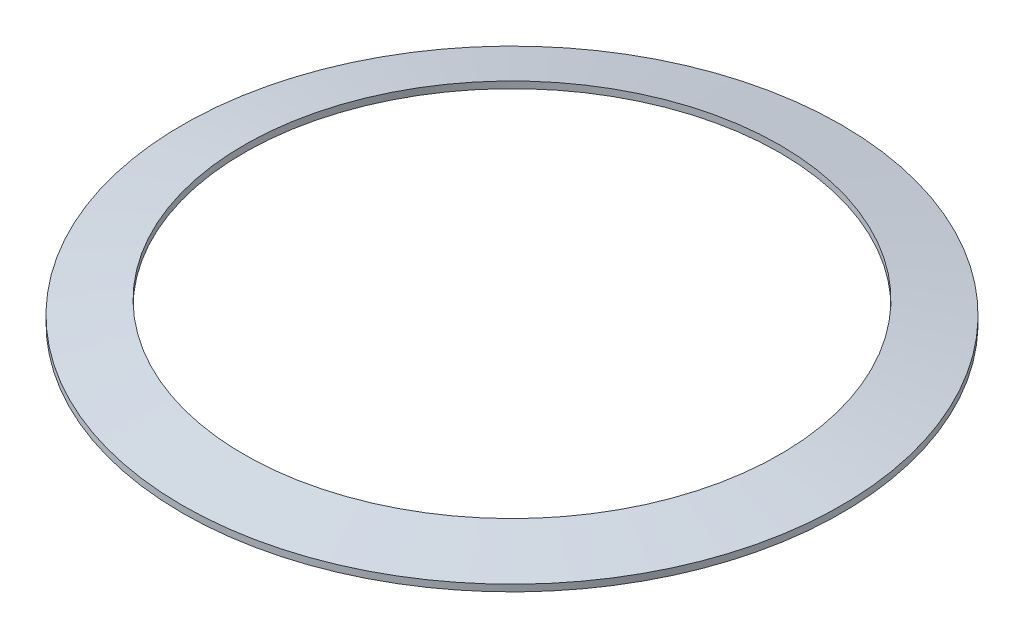
ISO-10303-21;
HEADER;
FILE_DESCRIPTION(('STEP AP214'),'2;1');
FILE_NAME('part.step','',(''),(''),'','','');
FILE_SCHEMA(('AUTOMOTIVE_DESIGN { 1 0 10303 214 1 1 1 1 }'));
ENDSEC;
DATA;
#1=APPLICATION_CONTEXT('core data for automotive mechanical design processes');
#2=APPLICATION_PROTOCOL_DEFINITION('international standard','automotive_design',2000,#1);
#3=PRODUCT_CONTEXT('',#1,'mechanical');
#4=PRODUCT('Part','Part','',(#3));
#5=PRODUCT_RELATED_PRODUCT_CATEGORY('part','',(#4));
#6=PRODUCT_DEFINITION_FORMATION('','',#4);
#7=PRODUCT_DEFINITION_CONTEXT('part definition',#1,'design');
#8=PRODUCT_DEFINITION('design','',#6,#7);
#9=PRODUCT_DEFINITION_SHAPE('','',#8);
#10=(LENGTH_UNIT() NAMED_UNIT(*) SI_UNIT(.MILLI.,.METRE.));
#11=(NAMED_UNIT(*) PLANE_ANGLE_UNIT() SI_UNIT($,.RADIAN.));
#12=(NAMED_UNIT(*) SI_UNIT($,.STERADIAN.) SOLID_ANGLE_UNIT());
#13=UNCERTAINTY_MEASURE_WITH_UNIT(LENGTH_MEASURE(1.E-05),#10,'distance_accuracy_value','');
#14=(GEOMETRIC_REPRESENTATION_CONTEXT(3) GLOBAL_UNCERTAINTY_ASSIGNED_CONTEXT((#13)) GLOBAL_UNIT_ASSIGNED_CONTEXT((#10,
#11,#12)) REPRESENTATION_CONTEXT('',''));
#15=CARTESIAN_POINT('',(0.,0.,0.));
#16=DIRECTION('',(0.,0.,1.));
#17=DIRECTION('',(1.,0.,0.));
#18=AXIS2_PLACEMENT_3D('',#15,#16,#17);
#19=CARTESIAN_POINT('',(0.,2.,0.));
#20=DIRECTION('',(0.,-1.,0.));
#21=DIRECTION('',(0.,0.,-1.));
#22=AXIS2_PLACEMENT_3D('',#19,#20,#21);
#23=CONICAL_SURFACE('',#22,40.25,1.3578579772155);
#24=CARTESIAN_POINT('',(0.,0.,0.));
#25=DIRECTION('',(0.,-1.,0.));
#26=DIRECTION('',(0.,0.,-1.));
#27=AXIS2_PLACEMENT_3D('',#24,#25,#26);
#28=CIRCLE('',#27,49.5);
#29=CARTESIAN_POINT('',(0.,0.,-49.5));
#30=VERTEX_POINT('',#29);
#31=EDGE_CURVE('E10',#30,#30,#28,.T.);
#32=ORIENTED_EDGE('',*,*,#31,.T.);
#33=EDGE_LOOP('',(#32));
#34=FACE_BOUND('',#33,.T.);
#35=CARTESIAN_POINT('',(0.,2.,0.));
#36=DIRECTION('',(0.,-1.,0.));
#37=DIRECTION('',(0.,0.,-1.));
#38=AXIS2_PLACEMENT_3D('',#35,#36,#37);
#39=CIRCLE('',#38,40.25);
#40=CARTESIAN_POINT('',(0.,2.,-40.25));
#41=VERTEX_POINT('',#40);
#42=EDGE_CURVE('E45',#41,#41,#39,.T.);
#43=ORIENTED_EDGE('',*,*,#42,.F.);
#44=EDGE_LOOP('',(#43));
#45=FACE_BOUND('',#44,.T.);
#46=ADVANCED_FACE('F31',(#34,#45),#23,.F.);
#47=CARTESIAN_POINT('',(0.,-4.82222222222222,0.));
#48=DIRECTION('',(0.,-1.,0.));
#49=DIRECTION('',(0.,0.,-1.));
#50=AXIS2_PLACEMENT_3D('',#47,#48,#49);
#51=CYLINDRICAL_SURFACE('',#50,49.5);
#52=CARTESIAN_POINT('',(0.,0.999999999999996,0.));
#53=DIRECTION('',(0.,-1.,0.));
#54=DIRECTION('',(0.,0.,-1.));
#55=AXIS2_PLACEMENT_3D('',#52,#53,#54);
#56=CIRCLE('',#55,49.5);
#57=CARTESIAN_POINT('',(0.,0.999999999999996,-49.5));
#58=VERTEX_POINT('',#57);
#59=EDGE_CURVE('E37',#58,#58,#56,.T.);
#60=ORIENTED_EDGE('',*,*,#59,.T.);
#61=EDGE_LOOP('',(#60));
#62=FACE_BOUND('',#61,.T.);
#63=ORIENTED_EDGE('',*,*,#31,.F.);
#64=EDGE_LOOP('',(#63));
#65=FACE_BOUND('',#64,.T.);
#66=ADVANCED_FACE('F55',(#62,#65),#51,.T.);
#67=CARTESIAN_POINT('',(0.,0.999999999999996,0.));
#68=DIRECTION('',(0.,-1.,0.));
#69=DIRECTION('',(0.,0.,-1.));
#70=AXIS2_PLACEMENT_3D('',#67,#68,#69);
#71=CONICAL_SURFACE('',#70,49.5,1.3578579772155);
#72=CARTESIAN_POINT('',(0.,2.99999999999999,0.));
#73=DIRECTION('',(0.,-1.,0.));
#74=DIRECTION('',(0.,0.,-1.));
#75=AXIS2_PLACEMENT_3D('',#72,#73,#74);
#76=CIRCLE('',#75,40.25);
#77=CARTESIAN_POINT('',(0.,2.99999999999999,-40.25));
#78=VERTEX_POINT('',#77);
#79=EDGE_CURVE('E41',#78,#78,#76,.T.);
#80=ORIENTED_EDGE('',*,*,#79,.T.);
#81=EDGE_LOOP('',(#80));
#82=FACE_BOUND('',#81,.T.);
#83=ORIENTED_EDGE('',*,*,#59,.F.);
#84=EDGE_LOOP('',(#83));
#85=FACE_BOUND('',#84,.T.);
#86=ADVANCED_FACE('F59',(#82,#85),#71,.T.);
#87=CARTESIAN_POINT('',(0.,-4.82222222222222,0.));
#88=DIRECTION('',(0.,-1.,0.));
#89=DIRECTION('',(0.,0.,-1.));
#90=AXIS2_PLACEMENT_3D('',#87,#88,#89);
#91=CYLINDRICAL_SURFACE('',#90,40.25);
#92=ORIENTED_EDGE('',*,*,#42,.T.);
#93=EDGE_LOOP('',(#92));
#94=FACE_BOUND('',#93,.T.);
#95=ORIENTED_EDGE('',*,*,#79,.F.);
#96=EDGE_LOOP('',(#95));
#97=FACE_BOUND('',#96,.T.);
#98=ADVANCED_FACE('F51',(#94,#97),#91,.F.);
#99=CLOSED_SHELL('',(#46,#66,#86,#98));
#100=MANIFOLD_SOLID_BREP('B2',#99);
#101=ADVANCED_BREP_SHAPE_REPRESENTATION('',(#18,#100),#14);
#102=SHAPE_DEFINITION_REPRESENTATION(#9,#101);
ENDSEC;
END-ISO-10303-21;
